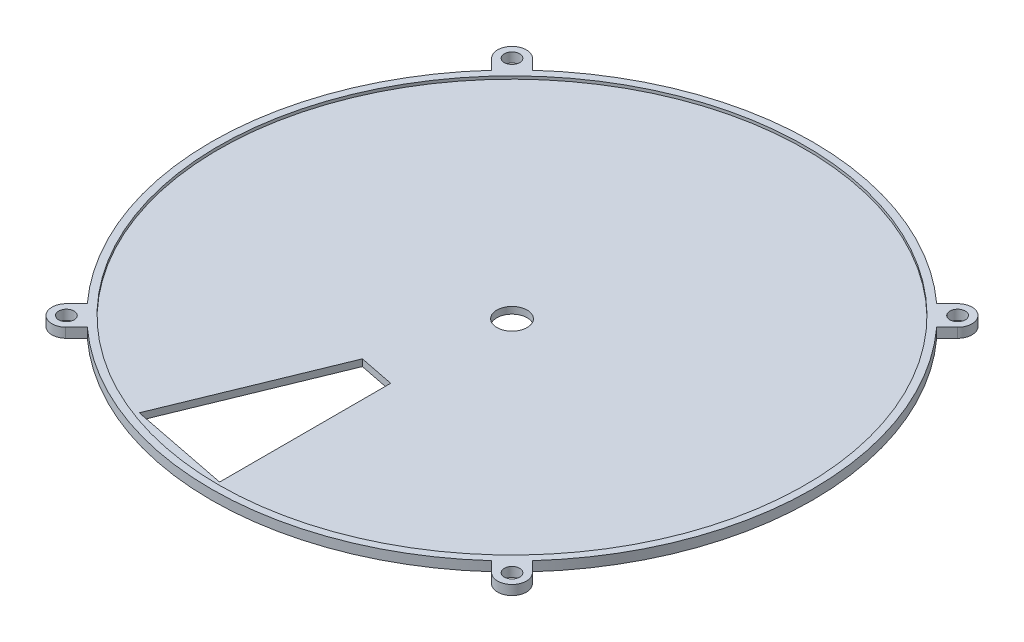
ISO-10303-21;
HEADER;
FILE_DESCRIPTION(('STEP AP214'),'2;1');
FILE_NAME('part.step','',(''),(''),'','','');
FILE_SCHEMA(('AUTOMOTIVE_DESIGN { 1 0 10303 214 1 1 1 1 }'));
ENDSEC;
DATA;
#1=APPLICATION_CONTEXT('core data for automotive mechanical design processes');
#2=APPLICATION_PROTOCOL_DEFINITION('international standard','automotive_design',2000,#1);
#3=PRODUCT_CONTEXT('',#1,'mechanical');
#4=PRODUCT('Part','Part','',(#3));
#5=PRODUCT_RELATED_PRODUCT_CATEGORY('part','',(#4));
#6=PRODUCT_DEFINITION_FORMATION('','',#4);
#7=PRODUCT_DEFINITION_CONTEXT('part definition',#1,'design');
#8=PRODUCT_DEFINITION('design','',#6,#7);
#9=PRODUCT_DEFINITION_SHAPE('','',#8);
#10=(LENGTH_UNIT() NAMED_UNIT(*) SI_UNIT(.MILLI.,.METRE.));
#11=(NAMED_UNIT(*) PLANE_ANGLE_UNIT() SI_UNIT($,.RADIAN.));
#12=(NAMED_UNIT(*) SI_UNIT($,.STERADIAN.) SOLID_ANGLE_UNIT());
#13=UNCERTAINTY_MEASURE_WITH_UNIT(LENGTH_MEASURE(1.E-05),#10,'distance_accuracy_value','');
#14=(GEOMETRIC_REPRESENTATION_CONTEXT(3) GLOBAL_UNCERTAINTY_ASSIGNED_CONTEXT((#13)) GLOBAL_UNIT_ASSIGNED_CONTEXT((#10,
#11,#12)) REPRESENTATION_CONTEXT('',''));
#15=CARTESIAN_POINT('',(0.,0.,0.));
#16=DIRECTION('',(0.,0.,1.));
#17=DIRECTION('',(1.,0.,0.));
#18=AXIS2_PLACEMENT_3D('',#15,#16,#17);
#19=CARTESIAN_POINT('',(2.11909880663364,2.,2.1190988066335));
#20=DIRECTION('',(-0.707106781186571,0.,-0.707106781186524));
#21=DIRECTION('',(-0.707106781186524,0.,0.707106781186571));
#22=AXIS2_PLACEMENT_3D('',#19,#20,#21);
#23=PLANE('',#22);
#24=DIRECTION('',(0.707106781186524,0.,-0.707106781186571));
#25=VECTOR('',#24,1.);
#26=CARTESIAN_POINT('',(2.11909880663364,0.,2.1190988066335));
#27=LINE('',#26,#25);
#28=CARTESIAN_POINT('',(-44.293453321693,0.,48.5316509349633));
#29=VERTEX_POINT('',#28);
#30=CARTESIAN_POINT('',(-42.0242406711131,0.,46.2624382843832));
#31=VERTEX_POINT('',#30);
#32=EDGE_CURVE('E270',#29,#31,#27,.T.);
#33=ORIENTED_EDGE('',*,*,#32,.T.);
#34=DIRECTION('',(0.,-1.,0.));
#35=VECTOR('',#34,1.);
#36=CARTESIAN_POINT('',(-42.0242406711131,2.,46.2624382843832));
#37=LINE('',#36,#35);
#38=CARTESIAN_POINT('',(-42.0242406711131,2.,46.2624382843832));
#39=VERTEX_POINT('',#38);
#40=EDGE_CURVE('E346',#39,#31,#37,.T.);
#41=ORIENTED_EDGE('',*,*,#40,.F.);
#42=DIRECTION('',(0.707106781186524,0.,-0.707106781186571));
#43=VECTOR('',#42,1.);
#44=CARTESIAN_POINT('',(2.11909880663364,2.,2.1190988066335));
#45=LINE('',#44,#43);
#46=CARTESIAN_POINT('',(-44.293453321693,2.,48.5316509349633));
#47=VERTEX_POINT('',#46);
#48=EDGE_CURVE('E221',#47,#39,#45,.T.);
#49=ORIENTED_EDGE('',*,*,#48,.F.);
#50=DIRECTION('',(0.,-1.,0.));
#51=VECTOR('',#50,1.);
#52=CARTESIAN_POINT('',(-44.293453321693,2.,48.5316509349633));
#53=LINE('',#52,#51);
#54=EDGE_CURVE('E258',#47,#29,#53,.T.);
#55=ORIENTED_EDGE('',*,*,#54,.T.);
#56=EDGE_LOOP('',(#33,#41,#49,#55));
#57=FACE_BOUND('',#56,.T.);
#58=ADVANCED_FACE('F35',(#57),#23,.F.);
#59=CARTESIAN_POINT('',(0.,2.,0.));
#60=DIRECTION('',(0.,-1.,0.));
#61=DIRECTION('',(0.,0.,-1.));
#62=AXIS2_PLACEMENT_3D('',#59,#60,#61);
#63=CYLINDRICAL_SURFACE('',#62,62.5);
#64=CARTESIAN_POINT('',(0.,0.,0.));
#65=DIRECTION('',(0.,1.,0.));
#66=DIRECTION('',(0.,0.,1.));
#67=AXIS2_PLACEMENT_3D('',#64,#65,#66);
#68=CIRCLE('',#67,62.5);
#69=CARTESIAN_POINT('',(42.02191243339,0.,46.2645531205102));
#70=VERTEX_POINT('',#69);
#71=EDGE_CURVE('E273',#31,#70,#68,.T.);
#72=ORIENTED_EDGE('',*,*,#71,.T.);
#73=DIRECTION('',(0.,-1.,0.));
#74=VECTOR('',#73,1.);
#75=CARTESIAN_POINT('',(42.02191243339,2.,46.2645531205102));
#76=LINE('',#75,#74);
#77=CARTESIAN_POINT('',(42.02191243339,2.,46.2645531205102));
#78=VERTEX_POINT('',#77);
#79=EDGE_CURVE('E344',#78,#70,#76,.T.);
#80=ORIENTED_EDGE('',*,*,#79,.F.);
#81=CARTESIAN_POINT('',(0.,2.,0.));
#82=DIRECTION('',(0.,1.,0.));
#83=DIRECTION('',(0.,0.,1.));
#84=AXIS2_PLACEMENT_3D('',#81,#82,#83);
#85=CIRCLE('',#84,62.5);
#86=EDGE_CURVE('E224',#39,#78,#85,.T.);
#87=ORIENTED_EDGE('',*,*,#86,.F.);
#88=ORIENTED_EDGE('',*,*,#40,.T.);
#89=EDGE_LOOP('',(#72,#80,#87,#88));
#90=FACE_BOUND('',#89,.T.);
#91=ADVANCED_FACE('F376',(#90),#63,.T.);
#92=CARTESIAN_POINT('',(-2.12132034355963,2.,2.12132034355958));
#93=DIRECTION('',(-0.707106781186555,0.,0.70710678118654));
#94=DIRECTION('',(0.70710678118654,0.,0.707106781186555));
#95=AXIS2_PLACEMENT_3D('',#92,#93,#94);
#96=PLANE('',#95);
#97=DIRECTION('',(-0.70710678118654,0.,-0.707106781186555));
#98=VECTOR('',#97,1.);
#99=CARTESIAN_POINT('',(-2.12132034355963,0.,2.12132034355958));
#100=LINE('',#99,#98);
#101=CARTESIAN_POINT('',(44.1941738241587,0.,48.4368145112789));
#102=VERTEX_POINT('',#101);
#103=EDGE_CURVE('E276',#102,#70,#100,.T.);
#104=ORIENTED_EDGE('',*,*,#103,.F.);
#105=DIRECTION('',(0.,-1.,0.));
#106=VECTOR('',#105,1.);
#107=CARTESIAN_POINT('',(44.1941738241587,2.,48.4368145112789));
#108=LINE('',#107,#106);
#109=CARTESIAN_POINT('',(44.1941738241587,2.,48.4368145112789));
#110=VERTEX_POINT('',#109);
#111=EDGE_CURVE('E342',#110,#102,#108,.T.);
#112=ORIENTED_EDGE('',*,*,#111,.F.);
#113=DIRECTION('',(-0.70710678118654,0.,-0.707106781186555));
#114=VECTOR('',#113,1.);
#115=CARTESIAN_POINT('',(-2.12132034355963,2.,2.12132034355958));
#116=LINE('',#115,#114);
#117=EDGE_CURVE('E226',#110,#78,#116,.T.);
#118=ORIENTED_EDGE('',*,*,#117,.T.);
#119=ORIENTED_EDGE('',*,*,#79,.T.);
#120=EDGE_LOOP('',(#104,#112,#118,#119));
#121=FACE_BOUND('',#120,.T.);
#122=ADVANCED_FACE('F382',(#121),#96,.T.);
#123=CARTESIAN_POINT('',(46.3154941677184,2.,46.3154941677193));
#124=DIRECTION('',(0.,-1.,0.));
#125=DIRECTION('',(0.,0.,-1.));
#126=AXIS2_PLACEMENT_3D('',#123,#124,#125);
#127=CYLINDRICAL_SURFACE('',#126,3.);
#128=CARTESIAN_POINT('',(46.3154941677184,0.,46.3154941677193));
#129=DIRECTION('',(0.,1.,0.));
#130=DIRECTION('',(0.,0.,1.));
#131=AXIS2_PLACEMENT_3D('',#128,#129,#130);
#132=CIRCLE('',#131,3.);
#133=CARTESIAN_POINT('',(48.5316509349628,0.,44.2934533216935));
#134=VERTEX_POINT('',#133);
#135=EDGE_CURVE('E279',#102,#134,#132,.T.);
#136=ORIENTED_EDGE('',*,*,#135,.T.);
#137=DIRECTION('',(0.,-1.,0.));
#138=VECTOR('',#137,1.);
#139=CARTESIAN_POINT('',(48.5316509349628,2.,44.2934533216935));
#140=LINE('',#139,#138);
#141=CARTESIAN_POINT('',(48.5316509349628,2.,44.2934533216935));
#142=VERTEX_POINT('',#141);
#143=EDGE_CURVE('E339',#142,#134,#140,.T.);
#144=ORIENTED_EDGE('',*,*,#143,.F.);
#145=CARTESIAN_POINT('',(46.3154941677184,2.,46.3154941677193));
#146=DIRECTION('',(0.,1.,0.));
#147=DIRECTION('',(0.,0.,1.));
#148=AXIS2_PLACEMENT_3D('',#145,#146,#147);
#149=CIRCLE('',#148,3.);
#150=EDGE_CURVE('E229',#110,#142,#149,.T.);
#151=ORIENTED_EDGE('',*,*,#150,.F.);
#152=ORIENTED_EDGE('',*,*,#111,.T.);
#153=EDGE_LOOP('',(#136,#144,#151,#152));
#154=FACE_BOUND('',#153,.T.);
#155=ADVANCED_FACE('F478',(#154),#127,.T.);
#156=CARTESIAN_POINT('',(2.11909880663354,2.,-2.11909880663363));
#157=DIRECTION('',(-0.707106781186531,0.,0.707106781186564));
#158=DIRECTION('',(0.707106781186564,0.,0.707106781186531));
#159=AXIS2_PLACEMENT_3D('',#156,#157,#158);
#160=PLANE('',#159);
#161=DIRECTION('',(-0.707106781186564,0.,-0.707106781186531));
#162=VECTOR('',#161,1.);
#163=CARTESIAN_POINT('',(2.11909880663354,0.,-2.11909880663363));
#164=LINE('',#163,#162);
#165=CARTESIAN_POINT('',(46.2624382843828,0.,42.0242406711136));
#166=VERTEX_POINT('',#165);
#167=EDGE_CURVE('E281',#134,#166,#164,.T.);
#168=ORIENTED_EDGE('',*,*,#167,.T.);
#169=DIRECTION('',(0.,-1.,0.));
#170=VECTOR('',#169,1.);
#171=CARTESIAN_POINT('',(46.2624382843828,2.,42.0242406711136));
#172=LINE('',#171,#170);
#173=CARTESIAN_POINT('',(46.2624382843828,2.,42.0242406711136));
#174=VERTEX_POINT('',#173);
#175=EDGE_CURVE('E336',#174,#166,#172,.T.);
#176=ORIENTED_EDGE('',*,*,#175,.F.);
#177=DIRECTION('',(-0.707106781186564,0.,-0.707106781186531));
#178=VECTOR('',#177,1.);
#179=CARTESIAN_POINT('',(2.11909880663354,2.,-2.11909880663363));
#180=LINE('',#179,#178);
#181=EDGE_CURVE('E231',#142,#174,#180,.T.);
#182=ORIENTED_EDGE('',*,*,#181,.F.);
#183=ORIENTED_EDGE('',*,*,#143,.T.);
#184=EDGE_LOOP('',(#168,#176,#182,#183));
#185=FACE_BOUND('',#184,.T.);
#186=ADVANCED_FACE('F474',(#185),#160,.F.);
#187=CARTESIAN_POINT('',(0.,2.,0.));
#188=DIRECTION('',(0.,-1.,0.));
#189=DIRECTION('',(0.,0.,-1.));
#190=AXIS2_PLACEMENT_3D('',#187,#188,#189);
#191=CYLINDRICAL_SURFACE('',#190,62.5);
#192=CARTESIAN_POINT('',(0.,0.,0.));
#193=DIRECTION('',(0.,1.,0.));
#194=DIRECTION('',(0.,0.,1.));
#195=AXIS2_PLACEMENT_3D('',#192,#193,#194);
#196=CIRCLE('',#195,62.5);
#197=CARTESIAN_POINT('',(46.26455312051,0.,-42.0219124333901));
#198=VERTEX_POINT('',#197);
#199=EDGE_CURVE('E283',#166,#198,#196,.T.);
#200=ORIENTED_EDGE('',*,*,#199,.T.);
#201=DIRECTION('',(0.,-1.,0.));
#202=VECTOR('',#201,1.);
#203=CARTESIAN_POINT('',(46.26455312051,2.,-42.0219124333901));
#204=LINE('',#203,#202);
#205=CARTESIAN_POINT('',(46.26455312051,2.,-42.0219124333901));
#206=VERTEX_POINT('',#205);
#207=EDGE_CURVE('E334',#206,#198,#204,.T.);
#208=ORIENTED_EDGE('',*,*,#207,.F.);
#209=CARTESIAN_POINT('',(0.,2.,0.));
#210=DIRECTION('',(0.,1.,0.));
#211=DIRECTION('',(0.,0.,1.));
#212=AXIS2_PLACEMENT_3D('',#209,#210,#211);
#213=CIRCLE('',#212,62.5);
#214=EDGE_CURVE('E233',#174,#206,#213,.T.);
#215=ORIENTED_EDGE('',*,*,#214,.F.);
#216=ORIENTED_EDGE('',*,*,#175,.T.);
#217=EDGE_LOOP('',(#200,#208,#215,#216));
#218=FACE_BOUND('',#217,.T.);
#219=ADVANCED_FACE('F469',(#218),#191,.T.);
#220=CARTESIAN_POINT('',(2.12132034355964,2.,2.12132034355967));
#221=DIRECTION('',(0.707106781186543,0.,0.707106781186552));
#222=DIRECTION('',(0.707106781186552,0.,-0.707106781186543));
#223=AXIS2_PLACEMENT_3D('',#220,#221,#222);
#224=PLANE('',#223);
#225=DIRECTION('',(-0.707106781186552,0.,0.707106781186543));
#226=VECTOR('',#225,1.);
#227=CARTESIAN_POINT('',(2.12132034355964,0.,2.12132034355967));
#228=LINE('',#227,#226);
#229=CARTESIAN_POINT('',(48.4368145112788,0.,-44.1941738241589));
#230=VERTEX_POINT('',#229);
#231=EDGE_CURVE('E286',#230,#198,#228,.T.);
#232=ORIENTED_EDGE('',*,*,#231,.F.);
#233=DIRECTION('',(0.,-1.,0.));
#234=VECTOR('',#233,1.);
#235=CARTESIAN_POINT('',(48.4368145112788,2.,-44.1941738241589));
#236=LINE('',#235,#234);
#237=CARTESIAN_POINT('',(48.4368145112788,2.,-44.1941738241589));
#238=VERTEX_POINT('',#237);
#239=EDGE_CURVE('E332',#238,#230,#236,.T.);
#240=ORIENTED_EDGE('',*,*,#239,.F.);
#241=DIRECTION('',(-0.707106781186552,0.,0.707106781186543));
#242=VECTOR('',#241,1.);
#243=CARTESIAN_POINT('',(2.12132034355964,2.,2.12132034355967));
#244=LINE('',#243,#242);
#245=EDGE_CURVE('E235',#238,#206,#244,.T.);
#246=ORIENTED_EDGE('',*,*,#245,.T.);
#247=ORIENTED_EDGE('',*,*,#207,.T.);
#248=EDGE_LOOP('',(#232,#240,#246,#247));
#249=FACE_BOUND('',#248,.T.);
#250=ADVANCED_FACE('F463',(#249),#224,.T.);
#251=CARTESIAN_POINT('',(46.3154941677192,2.,-46.3154941677186));
#252=DIRECTION('',(0.,-1.,0.));
#253=DIRECTION('',(0.,0.,-1.));
#254=AXIS2_PLACEMENT_3D('',#251,#252,#253);
#255=CYLINDRICAL_SURFACE('',#254,3.);
#256=CARTESIAN_POINT('',(46.3154941677192,0.,-46.3154941677186));
#257=DIRECTION('',(0.,1.,0.));
#258=DIRECTION('',(0.,0.,1.));
#259=AXIS2_PLACEMENT_3D('',#256,#257,#258);
#260=CIRCLE('',#259,3.);
#261=CARTESIAN_POINT('',(44.2934533216933,0.,-48.5316509349629));
#262=VERTEX_POINT('',#261);
#263=EDGE_CURVE('E289',#230,#262,#260,.T.);
#264=ORIENTED_EDGE('',*,*,#263,.T.);
#265=DIRECTION('',(0.,-1.,0.));
#266=VECTOR('',#265,1.);
#267=CARTESIAN_POINT('',(44.2934533216933,2.,-48.5316509349629));
#268=LINE('',#267,#266);
#269=CARTESIAN_POINT('',(44.2934533216933,2.,-48.5316509349629));
#270=VERTEX_POINT('',#269);
#271=EDGE_CURVE('E329',#270,#262,#268,.T.);
#272=ORIENTED_EDGE('',*,*,#271,.F.);
#273=CARTESIAN_POINT('',(46.3154941677192,2.,-46.3154941677186));
#274=DIRECTION('',(0.,1.,0.));
#275=DIRECTION('',(0.,0.,1.));
#276=AXIS2_PLACEMENT_3D('',#273,#274,#275);
#277=CIRCLE('',#276,3.);
#278=EDGE_CURVE('E238',#238,#270,#277,.T.);
#279=ORIENTED_EDGE('',*,*,#278,.F.);
#280=ORIENTED_EDGE('',*,*,#239,.T.);
#281=EDGE_LOOP('',(#264,#272,#279,#280));
#282=FACE_BOUND('',#281,.T.);
#283=ADVANCED_FACE('F460',(#282),#255,.T.);
#284=CARTESIAN_POINT('',(-2.11909880663366,2.,-2.11909880663355));
#285=DIRECTION('',(0.707106781186566,0.,0.707106781186529));
#286=DIRECTION('',(0.707106781186529,0.,-0.707106781186566));
#287=AXIS2_PLACEMENT_3D('',#284,#285,#286);
#288=PLANE('',#287);
#289=DIRECTION('',(-0.707106781186529,0.,0.707106781186566));
#290=VECTOR('',#289,1.);
#291=CARTESIAN_POINT('',(-2.11909880663366,0.,-2.11909880663355));
#292=LINE('',#291,#290);
#293=CARTESIAN_POINT('',(42.0242406711134,0.,-46.2624382843829));
#294=VERTEX_POINT('',#293);
#295=EDGE_CURVE('E291',#262,#294,#292,.T.);
#296=ORIENTED_EDGE('',*,*,#295,.T.);
#297=DIRECTION('',(0.,-1.,0.));
#298=VECTOR('',#297,1.);
#299=CARTESIAN_POINT('',(42.0242406711134,2.,-46.2624382843829));
#300=LINE('',#299,#298);
#301=CARTESIAN_POINT('',(42.0242406711134,2.,-46.2624382843829));
#302=VERTEX_POINT('',#301);
#303=EDGE_CURVE('E326',#302,#294,#300,.T.);
#304=ORIENTED_EDGE('',*,*,#303,.F.);
#305=DIRECTION('',(-0.707106781186529,0.,0.707106781186566));
#306=VECTOR('',#305,1.);
#307=CARTESIAN_POINT('',(-2.11909880663366,2.,-2.11909880663355));
#308=LINE('',#307,#306);
#309=EDGE_CURVE('E240',#270,#302,#308,.T.);
#310=ORIENTED_EDGE('',*,*,#309,.F.);
#311=ORIENTED_EDGE('',*,*,#271,.T.);
#312=EDGE_LOOP('',(#296,#304,#310,#311));
#313=FACE_BOUND('',#312,.T.);
#314=ADVANCED_FACE('F455',(#313),#288,.F.);
#315=CARTESIAN_POINT('',(0.,2.,0.));
#316=DIRECTION('',(0.,-1.,0.));
#317=DIRECTION('',(0.,0.,-1.));
#318=AXIS2_PLACEMENT_3D('',#315,#316,#317);
#319=CYLINDRICAL_SURFACE('',#318,62.5);
#320=CARTESIAN_POINT('',(0.,0.,0.));
#321=DIRECTION('',(0.,1.,0.));
#322=DIRECTION('',(0.,0.,1.));
#323=AXIS2_PLACEMENT_3D('',#320,#321,#322);
#324=CIRCLE('',#323,62.5);
#325=CARTESIAN_POINT('',(-42.0219124333903,0.,-46.2645531205099));
#326=VERTEX_POINT('',#325);
#327=EDGE_CURVE('E293',#294,#326,#324,.T.);
#328=ORIENTED_EDGE('',*,*,#327,.T.);
#329=DIRECTION('',(0.,-1.,0.));
#330=VECTOR('',#329,1.);
#331=CARTESIAN_POINT('',(-42.0219124333903,2.,-46.2645531205099));
#332=LINE('',#331,#330);
#333=CARTESIAN_POINT('',(-42.0219124333903,2.,-46.2645531205099));
#334=VERTEX_POINT('',#333);
#335=EDGE_CURVE('E324',#334,#326,#332,.T.);
#336=ORIENTED_EDGE('',*,*,#335,.F.);
#337=CARTESIAN_POINT('',(0.,2.,0.));
#338=DIRECTION('',(0.,1.,0.));
#339=DIRECTION('',(0.,0.,1.));
#340=AXIS2_PLACEMENT_3D('',#337,#338,#339);
#341=CIRCLE('',#340,62.5);
#342=EDGE_CURVE('E242',#302,#334,#341,.T.);
#343=ORIENTED_EDGE('',*,*,#342,.F.);
#344=ORIENTED_EDGE('',*,*,#303,.T.);
#345=EDGE_LOOP('',(#328,#336,#343,#344));
#346=FACE_BOUND('',#345,.T.);
#347=ADVANCED_FACE('F449',(#346),#319,.T.);
#348=CARTESIAN_POINT('',(2.12132034355965,2.,-2.12132034355963));
#349=DIRECTION('',(0.70710678118655,0.,-0.707106781186545));
#350=DIRECTION('',(-0.707106781186545,0.,-0.70710678118655));
#351=AXIS2_PLACEMENT_3D('',#348,#349,#350);
#352=PLANE('',#351);
#353=DIRECTION('',(0.707106781186545,0.,0.70710678118655));
#354=VECTOR('',#353,1.);
#355=CARTESIAN_POINT('',(2.12132034355965,0.,-2.12132034355963));
#356=LINE('',#355,#354);
#357=CARTESIAN_POINT('',(-44.1941738241591,0.,-48.4368145112786));
#358=VERTEX_POINT('',#357);
#359=EDGE_CURVE('E296',#358,#326,#356,.T.);
#360=ORIENTED_EDGE('',*,*,#359,.F.);
#361=DIRECTION('',(0.,-1.,0.));
#362=VECTOR('',#361,1.);
#363=CARTESIAN_POINT('',(-44.1941738241591,2.,-48.4368145112786));
#364=LINE('',#363,#362);
#365=CARTESIAN_POINT('',(-44.1941738241591,2.,-48.4368145112786));
#366=VERTEX_POINT('',#365);
#367=EDGE_CURVE('E322',#366,#358,#364,.T.);
#368=ORIENTED_EDGE('',*,*,#367,.F.);
#369=DIRECTION('',(0.707106781186545,0.,0.70710678118655));
#370=VECTOR('',#369,1.);
#371=CARTESIAN_POINT('',(2.12132034355965,2.,-2.12132034355963));
#372=LINE('',#371,#370);
#373=EDGE_CURVE('E244',#366,#334,#372,.T.);
#374=ORIENTED_EDGE('',*,*,#373,.T.);
#375=ORIENTED_EDGE('',*,*,#335,.T.);
#376=EDGE_LOOP('',(#360,#368,#374,#375));
#377=FACE_BOUND('',#376,.T.);
#378=ADVANCED_FACE('F445',(#377),#352,.T.);
#379=CARTESIAN_POINT('',(-46.3154941677187,2.,-46.315494167719));
#380=DIRECTION('',(0.,-1.,0.));
#381=DIRECTION('',(0.,0.,-1.));
#382=AXIS2_PLACEMENT_3D('',#379,#380,#381);
#383=CYLINDRICAL_SURFACE('',#382,3.);
#384=CARTESIAN_POINT('',(-46.3154941677187,0.,-46.315494167719));
#385=DIRECTION('',(0.,1.,0.));
#386=DIRECTION('',(0.,0.,1.));
#387=AXIS2_PLACEMENT_3D('',#384,#385,#386);
#388=CIRCLE('',#387,3.);
#389=CARTESIAN_POINT('',(-48.5316509349631,0.,-44.2934533216931));
#390=VERTEX_POINT('',#389);
#391=EDGE_CURVE('E299',#358,#390,#388,.T.);
#392=ORIENTED_EDGE('',*,*,#391,.T.);
#393=DIRECTION('',(0.,-1.,0.));
#394=VECTOR('',#393,1.);
#395=CARTESIAN_POINT('',(-48.5316509349631,2.,-44.2934533216931));
#396=LINE('',#395,#394);
#397=CARTESIAN_POINT('',(-48.5316509349631,2.,-44.2934533216931));
#398=VERTEX_POINT('',#397);
#399=EDGE_CURVE('E319',#398,#390,#396,.T.);
#400=ORIENTED_EDGE('',*,*,#399,.F.);
#401=CARTESIAN_POINT('',(-46.3154941677187,2.,-46.315494167719));
#402=DIRECTION('',(0.,1.,0.));
#403=DIRECTION('',(0.,0.,1.));
#404=AXIS2_PLACEMENT_3D('',#401,#402,#403);
#405=CIRCLE('',#404,3.);
#406=EDGE_CURVE('E247',#366,#398,#405,.T.);
#407=ORIENTED_EDGE('',*,*,#406,.F.);
#408=ORIENTED_EDGE('',*,*,#367,.T.);
#409=EDGE_LOOP('',(#392,#400,#407,#408));
#410=FACE_BOUND('',#409,.T.);
#411=ADVANCED_FACE('F440',(#410),#383,.T.);
#412=CARTESIAN_POINT('',(-2.1190988066335,2.,2.11909880663362));
#413=DIRECTION('',(0.707106781186526,0.,-0.707106781186569));
#414=DIRECTION('',(-0.707106781186569,0.,-0.707106781186526));
#415=AXIS2_PLACEMENT_3D('',#412,#413,#414);
#416=PLANE('',#415);
#417=DIRECTION('',(0.707106781186569,0.,0.707106781186526));
#418=VECTOR('',#417,1.);
#419=CARTESIAN_POINT('',(-2.1190988066335,0.,2.11909880663362));
#420=LINE('',#419,#418);
#421=CARTESIAN_POINT('',(-46.2624382843831,0.,-42.0242406711132));
#422=VERTEX_POINT('',#421);
#423=EDGE_CURVE('E301',#390,#422,#420,.T.);
#424=ORIENTED_EDGE('',*,*,#423,.T.);
#425=DIRECTION('',(0.,-1.,0.));
#426=VECTOR('',#425,1.);
#427=CARTESIAN_POINT('',(-46.2624382843831,2.,-42.0242406711132));
#428=LINE('',#427,#426);
#429=CARTESIAN_POINT('',(-46.2624382843831,2.,-42.0242406711132));
#430=VERTEX_POINT('',#429);
#431=EDGE_CURVE('E316',#430,#422,#428,.T.);
#432=ORIENTED_EDGE('',*,*,#431,.F.);
#433=DIRECTION('',(0.707106781186569,0.,0.707106781186526));
#434=VECTOR('',#433,1.);
#435=CARTESIAN_POINT('',(-2.1190988066335,2.,2.11909880663362));
#436=LINE('',#435,#434);
#437=EDGE_CURVE('E249',#398,#430,#436,.T.);
#438=ORIENTED_EDGE('',*,*,#437,.F.);
#439=ORIENTED_EDGE('',*,*,#399,.T.);
#440=EDGE_LOOP('',(#424,#432,#438,#439));
#441=FACE_BOUND('',#440,.T.);
#442=ADVANCED_FACE('F436',(#441),#416,.F.);
#443=CARTESIAN_POINT('',(0.,2.,0.));
#444=DIRECTION('',(0.,-1.,0.));
#445=DIRECTION('',(0.,0.,-1.));
#446=AXIS2_PLACEMENT_3D('',#443,#444,#445);
#447=CYLINDRICAL_SURFACE('',#446,62.5);
#448=CARTESIAN_POINT('',(0.,0.,0.));
#449=DIRECTION('',(0.,1.,0.));
#450=DIRECTION('',(0.,0.,1.));
#451=AXIS2_PLACEMENT_3D('',#448,#449,#450);
#452=CIRCLE('',#451,62.5);
#453=CARTESIAN_POINT('',(-46.2645531205097,0.,42.0219124333905));
#454=VERTEX_POINT('',#453);
#455=EDGE_CURVE('E303',#422,#454,#452,.T.);
#456=ORIENTED_EDGE('',*,*,#455,.T.);
#457=DIRECTION('',(0.,-1.,0.));
#458=VECTOR('',#457,1.);
#459=CARTESIAN_POINT('',(-46.2645531205097,2.,42.0219124333905));
#460=LINE('',#459,#458);
#461=CARTESIAN_POINT('',(-46.2645531205097,2.,42.0219124333905));
#462=VERTEX_POINT('',#461);
#463=EDGE_CURVE('E314',#462,#454,#460,.T.);
#464=ORIENTED_EDGE('',*,*,#463,.F.);
#465=CARTESIAN_POINT('',(0.,2.,0.));
#466=DIRECTION('',(0.,1.,0.));
#467=DIRECTION('',(0.,0.,1.));
#468=AXIS2_PLACEMENT_3D('',#465,#466,#467);
#469=CIRCLE('',#468,62.5);
#470=EDGE_CURVE('E251',#430,#462,#469,.T.);
#471=ORIENTED_EDGE('',*,*,#470,.F.);
#472=ORIENTED_EDGE('',*,*,#431,.T.);
#473=EDGE_LOOP('',(#456,#464,#471,#472));
#474=FACE_BOUND('',#473,.T.);
#475=ADVANCED_FACE('F431',(#474),#447,.T.);
#476=CARTESIAN_POINT('',(-2.12132034355963,2.,-2.12132034355963));
#477=DIRECTION('',(-0.707106781186547,0.,-0.707106781186547));
#478=DIRECTION('',(-0.707106781186548,0.,0.707106781186548));
#479=AXIS2_PLACEMENT_3D('',#476,#477,#478);
#480=PLANE('',#479);
#481=DIRECTION('',(0.707106781186548,0.,-0.707106781186548));
#482=VECTOR('',#481,1.);
#483=CARTESIAN_POINT('',(-2.12132034355963,0.,-2.12132034355963));
#484=LINE('',#483,#482);
#485=CARTESIAN_POINT('',(-48.4368145112785,0.,44.1941738241592));
#486=VERTEX_POINT('',#485);
#487=EDGE_CURVE('E306',#486,#454,#484,.T.);
#488=ORIENTED_EDGE('',*,*,#487,.F.);
#489=DIRECTION('',(0.,-1.,0.));
#490=VECTOR('',#489,1.);
#491=CARTESIAN_POINT('',(-48.4368145112785,2.,44.1941738241592));
#492=LINE('',#491,#490);
#493=CARTESIAN_POINT('',(-48.4368145112785,2.,44.1941738241592));
#494=VERTEX_POINT('',#493);
#495=EDGE_CURVE('E312',#494,#486,#492,.T.);
#496=ORIENTED_EDGE('',*,*,#495,.F.);
#497=DIRECTION('',(0.707106781186548,0.,-0.707106781186548));
#498=VECTOR('',#497,1.);
#499=CARTESIAN_POINT('',(-2.12132034355963,2.,-2.12132034355963));
#500=LINE('',#499,#498);
#501=EDGE_CURVE('E253',#494,#462,#500,.T.);
#502=ORIENTED_EDGE('',*,*,#501,.T.);
#503=ORIENTED_EDGE('',*,*,#463,.T.);
#504=EDGE_LOOP('',(#488,#496,#502,#503));
#505=FACE_BOUND('',#504,.T.);
#506=ADVANCED_FACE('F391',(#505),#480,.T.);
#507=CARTESIAN_POINT('',(46.3154941677184,2.,46.3154941677193));
#508=DIRECTION('',(0.,-1.,0.));
#509=DIRECTION('',(0.,0.,-1.));
#510=AXIS2_PLACEMENT_3D('',#507,#508,#509);
#511=CYLINDRICAL_SURFACE('',#510,1.6);
#512=CARTESIAN_POINT('',(46.3154941677184,2.,46.3154941677193));
#513=DIRECTION('',(0.,1.,0.));
#514=DIRECTION('',(0.,0.,1.));
#515=AXIS2_PLACEMENT_3D('',#512,#513,#514);
#516=CIRCLE('',#515,1.6);
#517=CARTESIAN_POINT('',(46.3154941677184,2.,47.9154941677193));
#518=VERTEX_POINT('',#517);
#519=EDGE_CURVE('E218',#518,#518,#516,.T.);
#520=ORIENTED_EDGE('',*,*,#519,.T.);
#521=EDGE_LOOP('',(#520));
#522=FACE_BOUND('',#521,.T.);
#523=CARTESIAN_POINT('',(46.3154941677184,0.,46.3154941677193));
#524=DIRECTION('',(0.,1.,0.));
#525=DIRECTION('',(0.,0.,1.));
#526=AXIS2_PLACEMENT_3D('',#523,#524,#525);
#527=CIRCLE('',#526,1.6);
#528=CARTESIAN_POINT('',(46.3154941677184,0.,47.9154941677193));
#529=VERTEX_POINT('',#528);
#530=EDGE_CURVE('E267',#529,#529,#527,.T.);
#531=ORIENTED_EDGE('',*,*,#530,.F.);
#532=EDGE_LOOP('',(#531));
#533=FACE_BOUND('',#532,.T.);
#534=ADVANCED_FACE('F387',(#522,#533),#511,.F.);
#535=CARTESIAN_POINT('',(46.3154941677192,2.,-46.3154941677186));
#536=DIRECTION('',(0.,-1.,0.));
#537=DIRECTION('',(0.,0.,-1.));
#538=AXIS2_PLACEMENT_3D('',#535,#536,#537);
#539=CYLINDRICAL_SURFACE('',#538,1.6);
#540=CARTESIAN_POINT('',(46.3154941677192,2.,-46.3154941677186));
#541=DIRECTION('',(0.,1.,0.));
#542=DIRECTION('',(0.,0.,1.));
#543=AXIS2_PLACEMENT_3D('',#540,#541,#542);
#544=CIRCLE('',#543,1.6);
#545=CARTESIAN_POINT('',(46.3154941677192,2.,-44.7154941677185));
#546=VERTEX_POINT('',#545);
#547=EDGE_CURVE('E215',#546,#546,#544,.T.);
#548=ORIENTED_EDGE('',*,*,#547,.T.);
#549=EDGE_LOOP('',(#548));
#550=FACE_BOUND('',#549,.T.);
#551=CARTESIAN_POINT('',(46.3154941677192,0.,-46.3154941677186));
#552=DIRECTION('',(0.,1.,0.));
#553=DIRECTION('',(0.,0.,1.));
#554=AXIS2_PLACEMENT_3D('',#551,#552,#553);
#555=CIRCLE('',#554,1.6);
#556=CARTESIAN_POINT('',(46.3154941677192,0.,-44.7154941677185));
#557=VERTEX_POINT('',#556);
#558=EDGE_CURVE('E264',#557,#557,#555,.T.);
#559=ORIENTED_EDGE('',*,*,#558,.F.);
#560=EDGE_LOOP('',(#559));
#561=FACE_BOUND('',#560,.T.);
#562=ADVANCED_FACE('F390',(#550,#561),#539,.F.);
#563=CARTESIAN_POINT('',(-46.3154941677187,2.,-46.315494167719));
#564=DIRECTION('',(0.,-1.,0.));
#565=DIRECTION('',(0.,0.,-1.));
#566=AXIS2_PLACEMENT_3D('',#563,#564,#565);
#567=CYLINDRICAL_SURFACE('',#566,1.6);
#568=CARTESIAN_POINT('',(-46.3154941677187,2.,-46.315494167719));
#569=DIRECTION('',(0.,1.,0.));
#570=DIRECTION('',(0.,0.,1.));
#571=AXIS2_PLACEMENT_3D('',#568,#569,#570);
#572=CIRCLE('',#571,1.6);
#573=CARTESIAN_POINT('',(-46.3154941677187,2.,-44.715494167719));
#574=VERTEX_POINT('',#573);
#575=EDGE_CURVE('E211',#574,#574,#572,.T.);
#576=ORIENTED_EDGE('',*,*,#575,.T.);
#577=EDGE_LOOP('',(#576));
#578=FACE_BOUND('',#577,.T.);
#579=CARTESIAN_POINT('',(-46.3154941677187,0.,-46.315494167719));
#580=DIRECTION('',(0.,1.,0.));
#581=DIRECTION('',(0.,0.,1.));
#582=AXIS2_PLACEMENT_3D('',#579,#580,#581);
#583=CIRCLE('',#582,1.6);
#584=CARTESIAN_POINT('',(-46.3154941677187,0.,-44.715494167719));
#585=VERTEX_POINT('',#584);
#586=EDGE_CURVE('E261',#585,#585,#583,.T.);
#587=ORIENTED_EDGE('',*,*,#586,.F.);
#588=EDGE_LOOP('',(#587));
#589=FACE_BOUND('',#588,.T.);
#590=ADVANCED_FACE('F394',(#578,#589),#567,.F.);
#591=CARTESIAN_POINT('',(-46.3154941677189,2.,46.3154941677189));
#592=DIRECTION('',(0.,-1.,0.));
#593=DIRECTION('',(0.,0.,-1.));
#594=AXIS2_PLACEMENT_3D('',#591,#592,#593);
#595=CYLINDRICAL_SURFACE('',#594,1.6);
#596=CARTESIAN_POINT('',(-46.3154941677189,2.,46.3154941677189));
#597=DIRECTION('',(0.,1.,0.));
#598=DIRECTION('',(0.,0.,1.));
#599=AXIS2_PLACEMENT_3D('',#596,#597,#598);
#600=CIRCLE('',#599,1.6);
#601=CARTESIAN_POINT('',(-46.3154941677189,2.,47.9154941677189));
#602=VERTEX_POINT('',#601);
#603=EDGE_CURVE('E208',#602,#602,#600,.T.);
#604=ORIENTED_EDGE('',*,*,#603,.T.);
#605=EDGE_LOOP('',(#604));
#606=FACE_BOUND('',#605,.T.);
#607=CARTESIAN_POINT('',(-46.3154941677189,0.,46.3154941677189));
#608=DIRECTION('',(0.,1.,0.));
#609=DIRECTION('',(0.,0.,1.));
#610=AXIS2_PLACEMENT_3D('',#607,#608,#609);
#611=CIRCLE('',#610,1.6);
#612=CARTESIAN_POINT('',(-46.3154941677189,0.,47.9154941677189));
#613=VERTEX_POINT('',#612);
#614=EDGE_CURVE('E205',#613,#613,#611,.T.);
#615=ORIENTED_EDGE('',*,*,#614,.F.);
#616=EDGE_LOOP('',(#615));
#617=FACE_BOUND('',#616,.T.);
#618=ADVANCED_FACE('F37',(#606,#617),#595,.F.);
#619=CARTESIAN_POINT('',(-46.3154941677189,2.,46.3154941677189));
#620=DIRECTION('',(0.,-1.,0.));
#621=DIRECTION('',(0.,0.,-1.));
#622=AXIS2_PLACEMENT_3D('',#619,#620,#621);
#623=CYLINDRICAL_SURFACE('',#622,3.);
#624=CARTESIAN_POINT('',(-46.3154941677189,0.,46.3154941677189));
#625=DIRECTION('',(0.,1.,0.));
#626=DIRECTION('',(0.,0.,1.));
#627=AXIS2_PLACEMENT_3D('',#624,#625,#626);
#628=CIRCLE('',#627,3.);
#629=EDGE_CURVE('E212',#486,#29,#628,.T.);
#630=ORIENTED_EDGE('',*,*,#629,.T.);
#631=ORIENTED_EDGE('',*,*,#54,.F.);
#632=CARTESIAN_POINT('',(-46.3154941677189,2.,46.3154941677189));
#633=DIRECTION('',(0.,1.,0.));
#634=DIRECTION('',(0.,0.,1.));
#635=AXIS2_PLACEMENT_3D('',#632,#633,#634);
#636=CIRCLE('',#635,3.);
#637=EDGE_CURVE('E256',#494,#47,#636,.T.);
#638=ORIENTED_EDGE('',*,*,#637,.F.);
#639=ORIENTED_EDGE('',*,*,#495,.T.);
#640=EDGE_LOOP('',(#630,#631,#638,#639));
#641=FACE_BOUND('',#640,.T.);
#642=ADVANCED_FACE('F401',(#641),#623,.T.);
#643=CARTESIAN_POINT('',(0.,2.,0.));
#644=DIRECTION('',(0.,1.,0.));
#645=DIRECTION('',(0.,0.,1.));
#646=AXIS2_PLACEMENT_3D('',#643,#644,#645);
#647=PLANE('',#646);
#648=CARTESIAN_POINT('',(0.,2.,0.));
#649=DIRECTION('',(0.,1.,0.));
#650=DIRECTION('',(0.,0.,1.));
#651=AXIS2_PLACEMENT_3D('',#648,#649,#650);
#652=CIRCLE('',#651,61.);
#653=CARTESIAN_POINT('',(0.,2.,61.));
#654=VERTEX_POINT('',#653);
#655=EDGE_CURVE('E201',#654,#654,#652,.T.);
#656=ORIENTED_EDGE('',*,*,#655,.F.);
#657=EDGE_LOOP('',(#656));
#658=FACE_BOUND('',#657,.T.);
#659=ORIENTED_EDGE('',*,*,#603,.F.);
#660=EDGE_LOOP('',(#659));
#661=FACE_BOUND('',#660,.T.);
#662=ORIENTED_EDGE('',*,*,#575,.F.);
#663=EDGE_LOOP('',(#662));
#664=FACE_BOUND('',#663,.T.);
#665=ORIENTED_EDGE('',*,*,#547,.F.);
#666=EDGE_LOOP('',(#665));
#667=FACE_BOUND('',#666,.T.);
#668=ORIENTED_EDGE('',*,*,#519,.F.);
#669=EDGE_LOOP('',(#668));
#670=FACE_BOUND('',#669,.T.);
#671=ORIENTED_EDGE('',*,*,#48,.T.);
#672=ORIENTED_EDGE('',*,*,#86,.T.);
#673=ORIENTED_EDGE('',*,*,#117,.F.);
#674=ORIENTED_EDGE('',*,*,#150,.T.);
#675=ORIENTED_EDGE('',*,*,#181,.T.);
#676=ORIENTED_EDGE('',*,*,#214,.T.);
#677=ORIENTED_EDGE('',*,*,#245,.F.);
#678=ORIENTED_EDGE('',*,*,#278,.T.);
#679=ORIENTED_EDGE('',*,*,#309,.T.);
#680=ORIENTED_EDGE('',*,*,#342,.T.);
#681=ORIENTED_EDGE('',*,*,#373,.F.);
#682=ORIENTED_EDGE('',*,*,#406,.T.);
#683=ORIENTED_EDGE('',*,*,#437,.T.);
#684=ORIENTED_EDGE('',*,*,#470,.T.);
#685=ORIENTED_EDGE('',*,*,#501,.F.);
#686=ORIENTED_EDGE('',*,*,#637,.T.);
#687=EDGE_LOOP('',(#671,#672,#673,#674,#675,#676,#677,#678,#679,#680,#681,#682,#683,#684,#685,#686));
#688=FACE_BOUND('',#687,.T.);
#689=ADVANCED_FACE('F410',(#658,#661,#664,#667,#670,#688),#647,.T.);
#690=CARTESIAN_POINT('',(0.,0.,0.));
#691=DIRECTION('',(0.,1.,0.));
#692=DIRECTION('',(0.,0.,1.));
#693=AXIS2_PLACEMENT_3D('',#690,#691,#692);
#694=PLANE('',#693);
#695=DIRECTION('',(-0.980785280403231,0.,-0.195090322016128));
#696=VECTOR('',#695,1.);
#697=CARTESIAN_POINT('',(-4.67248648068766,0.,23.4901758107853));
#698=LINE('',#697,#696);
#699=CARTESIAN_POINT('',(-1.,0.,24.2206787908287));
#700=VERTEX_POINT('',#699);
#701=CARTESIAN_POINT('',(-8.34167509292234,0.,22.7603288175632));
#702=VERTEX_POINT('',#701);
#703=EDGE_CURVE('E168',#700,#702,#698,.T.);
#704=ORIENTED_EDGE('',*,*,#703,.T.);
#705=DIRECTION('',(-0.378973902423538,0.,0.925407359643241));
#706=VECTOR('',#705,1.);
#707=CARTESIAN_POINT('',(0.838532994451592,0.,0.343397010956044));
#708=LINE('',#707,#706);
#709=CARTESIAN_POINT('',(-21.8183111293748,0.,55.6686058561983));
#710=VERTEX_POINT('',#709);
#711=EDGE_CURVE('E190',#702,#710,#708,.T.);
#712=ORIENTED_EDGE('',*,*,#711,.T.);
#713=DIRECTION('',(-0.981024404411302,0.,-0.193884290104822));
#714=VECTOR('',#713,1.);
#715=CARTESIAN_POINT('',(-11.4086341436075,0.,57.7259174006722));
#716=LINE('',#715,#714);
#717=CARTESIAN_POINT('',(-1.,0.,59.7830228435334));
#718=VERTEX_POINT('',#717);
#719=EDGE_CURVE('E188',#718,#710,#716,.T.);
#720=ORIENTED_EDGE('',*,*,#719,.F.);
#721=DIRECTION('',(0.,0.,-1.));
#722=VECTOR('',#721,1.);
#723=CARTESIAN_POINT('',(-0.999999999999999,0.,0.));
#724=LINE('',#723,#722);
#725=EDGE_CURVE('E173',#718,#700,#724,.T.);
#726=ORIENTED_EDGE('',*,*,#725,.T.);
#727=EDGE_LOOP('',(#704,#712,#720,#726));
#728=FACE_BOUND('',#727,.T.);
#729=CARTESIAN_POINT('',(0.,0.,0.));
#730=DIRECTION('',(0.,1.,0.));
#731=DIRECTION('',(0.,0.,1.));
#732=AXIS2_PLACEMENT_3D('',#729,#730,#731);
#733=CIRCLE('',#732,3.15);
#734=CARTESIAN_POINT('',(0.,0.,3.15));
#735=VERTEX_POINT('',#734);
#736=EDGE_CURVE('E198',#735,#735,#733,.T.);
#737=ORIENTED_EDGE('',*,*,#736,.T.);
#738=EDGE_LOOP('',(#737));
#739=FACE_BOUND('',#738,.T.);
#740=ORIENTED_EDGE('',*,*,#614,.T.);
#741=EDGE_LOOP('',(#740));
#742=FACE_BOUND('',#741,.T.);
#743=ORIENTED_EDGE('',*,*,#586,.T.);
#744=EDGE_LOOP('',(#743));
#745=FACE_BOUND('',#744,.T.);
#746=ORIENTED_EDGE('',*,*,#558,.T.);
#747=EDGE_LOOP('',(#746));
#748=FACE_BOUND('',#747,.T.);
#749=ORIENTED_EDGE('',*,*,#530,.T.);
#750=EDGE_LOOP('',(#749));
#751=FACE_BOUND('',#750,.T.);
#752=ORIENTED_EDGE('',*,*,#32,.F.);
#753=ORIENTED_EDGE('',*,*,#629,.F.);
#754=ORIENTED_EDGE('',*,*,#487,.T.);
#755=ORIENTED_EDGE('',*,*,#455,.F.);
#756=ORIENTED_EDGE('',*,*,#423,.F.);
#757=ORIENTED_EDGE('',*,*,#391,.F.);
#758=ORIENTED_EDGE('',*,*,#359,.T.);
#759=ORIENTED_EDGE('',*,*,#327,.F.);
#760=ORIENTED_EDGE('',*,*,#295,.F.);
#761=ORIENTED_EDGE('',*,*,#263,.F.);
#762=ORIENTED_EDGE('',*,*,#231,.T.);
#763=ORIENTED_EDGE('',*,*,#199,.F.);
#764=ORIENTED_EDGE('',*,*,#167,.F.);
#765=ORIENTED_EDGE('',*,*,#135,.F.);
#766=ORIENTED_EDGE('',*,*,#103,.T.);
#767=ORIENTED_EDGE('',*,*,#71,.F.);
#768=EDGE_LOOP('',(#752,#753,#754,#755,#756,#757,#758,#759,#760,#761,#762,#763,#764,#765,#766,#767));
#769=FACE_BOUND('',#768,.T.);
#770=ADVANCED_FACE('F186',(#728,#739,#742,#745,#748,#751,#769),#694,.F.);
#771=CARTESIAN_POINT('',(0.,1.4,0.));
#772=DIRECTION('',(0.,1.,0.));
#773=DIRECTION('',(0.,0.,1.));
#774=AXIS2_PLACEMENT_3D('',#771,#772,#773);
#775=CYLINDRICAL_SURFACE('',#774,61.);
#776=CARTESIAN_POINT('',(0.,1.4,0.));
#777=DIRECTION('',(0.,1.,0.));
#778=DIRECTION('',(0.,0.,1.));
#779=AXIS2_PLACEMENT_3D('',#776,#777,#778);
#780=CIRCLE('',#779,61.);
#781=CARTESIAN_POINT('',(0.,1.4,61.));
#782=VERTEX_POINT('',#781);
#783=EDGE_CURVE('E202',#782,#782,#780,.T.);
#784=ORIENTED_EDGE('',*,*,#783,.F.);
#785=EDGE_LOOP('',(#784));
#786=FACE_BOUND('',#785,.T.);
#787=ORIENTED_EDGE('',*,*,#655,.T.);
#788=EDGE_LOOP('',(#787));
#789=FACE_BOUND('',#788,.T.);
#790=ADVANCED_FACE('F409',(#786,#789),#775,.F.);
#791=CARTESIAN_POINT('',(0.,1.4,0.));
#792=DIRECTION('',(0.,1.,0.));
#793=DIRECTION('',(0.,0.,1.));
#794=AXIS2_PLACEMENT_3D('',#791,#792,#793);
#795=PLANE('',#794);
#796=DIRECTION('',(-0.378973902423538,0.,0.925407359643241));
#797=VECTOR('',#796,1.);
#798=CARTESIAN_POINT('',(0.838532994451592,1.4,0.343397010956044));
#799=LINE('',#798,#797);
#800=CARTESIAN_POINT('',(-8.34167509292234,1.40000000000001,22.7603288175632));
#801=VERTEX_POINT('',#800);
#802=CARTESIAN_POINT('',(-21.8183111293748,1.40000000000001,55.6686058561983));
#803=VERTEX_POINT('',#802);
#804=EDGE_CURVE('E11',#801,#803,#799,.T.);
#805=ORIENTED_EDGE('',*,*,#804,.F.);
#806=DIRECTION('',(-0.980785280403231,0.,-0.195090322016128));
#807=VECTOR('',#806,1.);
#808=CARTESIAN_POINT('',(-4.67248648068766,1.4,23.4901758107853));
#809=LINE('',#808,#807);
#810=CARTESIAN_POINT('',(-1.,1.4,24.2206787908287));
#811=VERTEX_POINT('',#810);
#812=EDGE_CURVE('E349',#811,#801,#809,.T.);
#813=ORIENTED_EDGE('',*,*,#812,.F.);
#814=DIRECTION('',(0.,0.,-1.));
#815=VECTOR('',#814,1.);
#816=CARTESIAN_POINT('',(-0.999999999999999,1.4,0.));
#817=LINE('',#816,#815);
#818=CARTESIAN_POINT('',(-1.,1.40000000000001,59.7830228435334));
#819=VERTEX_POINT('',#818);
#820=EDGE_CURVE('E181',#819,#811,#817,.T.);
#821=ORIENTED_EDGE('',*,*,#820,.F.);
#822=DIRECTION('',(-0.981024404411302,0.,-0.193884290104822));
#823=VECTOR('',#822,1.);
#824=CARTESIAN_POINT('',(-11.4086341436075,1.4,57.7259174006722));
#825=LINE('',#824,#823);
#826=EDGE_CURVE('E43',#819,#803,#825,.T.);
#827=ORIENTED_EDGE('',*,*,#826,.T.);
#828=EDGE_LOOP('',(#805,#813,#821,#827));
#829=FACE_BOUND('',#828,.T.);
#830=CARTESIAN_POINT('',(0.,1.4,0.));
#831=DIRECTION('',(0.,1.,0.));
#832=DIRECTION('',(0.,0.,1.));
#833=AXIS2_PLACEMENT_3D('',#830,#831,#832);
#834=CIRCLE('',#833,3.15);
#835=CARTESIAN_POINT('',(0.,1.4,3.15));
#836=VERTEX_POINT('',#835);
#837=EDGE_CURVE('E195',#836,#836,#834,.T.);
#838=ORIENTED_EDGE('',*,*,#837,.F.);
#839=EDGE_LOOP('',(#838));
#840=FACE_BOUND('',#839,.T.);
#841=ORIENTED_EDGE('',*,*,#783,.T.);
#842=EDGE_LOOP('',(#841));
#843=FACE_BOUND('',#842,.T.);
#844=ADVANCED_FACE('F354',(#829,#840,#843),#795,.T.);
#845=CARTESIAN_POINT('',(0.,-0.6,0.));
#846=DIRECTION('',(0.,1.,0.));
#847=DIRECTION('',(0.,0.,1.));
#848=AXIS2_PLACEMENT_3D('',#845,#846,#847);
#849=CYLINDRICAL_SURFACE('',#848,3.15);
#850=ORIENTED_EDGE('',*,*,#837,.T.);
#851=EDGE_LOOP('',(#850));
#852=FACE_BOUND('',#851,.T.);
#853=ORIENTED_EDGE('',*,*,#736,.F.);
#854=EDGE_LOOP('',(#853));
#855=FACE_BOUND('',#854,.T.);
#856=ADVANCED_FACE('F365',(#852,#855),#849,.F.);
#857=CARTESIAN_POINT('',(-21.8183111293748,56.,55.6686058561983));
#858=DIRECTION('',(-0.925407359643241,0.,-0.378973902423537));
#859=DIRECTION('',(-0.378973902423538,0.,0.925407359643241));
#860=AXIS2_PLACEMENT_3D('',#857,#858,#859);
#861=PLANE('',#860);
#862=DIRECTION('',(0.,-1.,0.));
#863=VECTOR('',#862,1.);
#864=CARTESIAN_POINT('',(-8.34167509292234,56.,22.7603288175632));
#865=LINE('',#864,#863);
#866=EDGE_CURVE('E50',#801,#702,#865,.T.);
#867=ORIENTED_EDGE('',*,*,#866,.F.);
#868=ORIENTED_EDGE('',*,*,#804,.T.);
#869=DIRECTION('',(0.,-1.,0.));
#870=VECTOR('',#869,1.);
#871=CARTESIAN_POINT('',(-21.8183111293748,56.,55.6686058561983));
#872=LINE('',#871,#870);
#873=EDGE_CURVE('E174',#803,#710,#872,.T.);
#874=ORIENTED_EDGE('',*,*,#873,.T.);
#875=ORIENTED_EDGE('',*,*,#711,.F.);
#876=EDGE_LOOP('',(#867,#868,#874,#875));
#877=FACE_BOUND('',#876,.T.);
#878=ADVANCED_FACE('F363',(#877),#861,.F.);
#879=CARTESIAN_POINT('',(-21.8183111293748,56.,55.6686058561983));
#880=DIRECTION('',(0.193884290104822,0.,-0.981024404411302));
#881=DIRECTION('',(-0.981024404411302,0.,-0.193884290104822));
#882=AXIS2_PLACEMENT_3D('',#879,#880,#881);
#883=PLANE('',#882);
#884=ORIENTED_EDGE('',*,*,#719,.T.);
#885=ORIENTED_EDGE('',*,*,#873,.F.);
#886=ORIENTED_EDGE('',*,*,#826,.F.);
#887=DIRECTION('',(0.,-1.,0.));
#888=VECTOR('',#887,1.);
#889=CARTESIAN_POINT('',(-1.,56.,59.7830228435334));
#890=LINE('',#889,#888);
#891=EDGE_CURVE('E183',#819,#718,#890,.T.);
#892=ORIENTED_EDGE('',*,*,#891,.T.);
#893=EDGE_LOOP('',(#884,#885,#886,#892));
#894=FACE_BOUND('',#893,.T.);
#895=ADVANCED_FACE('F358',(#894),#883,.T.);
#896=CARTESIAN_POINT('',(-1.,56.,24.2206787908287));
#897=DIRECTION('',(1.,0.,0.));
#898=DIRECTION('',(0.,0.,-1.));
#899=AXIS2_PLACEMENT_3D('',#896,#897,#898);
#900=PLANE('',#899);
#901=ORIENTED_EDGE('',*,*,#891,.F.);
#902=ORIENTED_EDGE('',*,*,#820,.T.);
#903=DIRECTION('',(0.,-1.,0.));
#904=VECTOR('',#903,1.);
#905=CARTESIAN_POINT('',(-1.,56.,24.2206787908287));
#906=LINE('',#905,#904);
#907=EDGE_CURVE('E55',#811,#700,#906,.T.);
#908=ORIENTED_EDGE('',*,*,#907,.T.);
#909=ORIENTED_EDGE('',*,*,#725,.F.);
#910=EDGE_LOOP('',(#901,#902,#908,#909));
#911=FACE_BOUND('',#910,.T.);
#912=ADVANCED_FACE('F178',(#911),#900,.F.);
#913=CARTESIAN_POINT('',(-8.34167509292234,56.,22.7603288175632));
#914=DIRECTION('',(0.195090322016128,0.,-0.98078528040323));
#915=DIRECTION('',(-0.980785280403231,0.,-0.195090322016128));
#916=AXIS2_PLACEMENT_3D('',#913,#914,#915);
#917=PLANE('',#916);
#918=ORIENTED_EDGE('',*,*,#907,.F.);
#919=ORIENTED_EDGE('',*,*,#812,.T.);
#920=ORIENTED_EDGE('',*,*,#866,.T.);
#921=ORIENTED_EDGE('',*,*,#703,.F.);
#922=EDGE_LOOP('',(#918,#919,#920,#921));
#923=FACE_BOUND('',#922,.T.);
#924=ADVANCED_FACE('F169',(#923),#917,.F.);
#925=CLOSED_SHELL('',(#58,#91,#122,#155,#186,#219,#250,#283,#314,#347,#378,#411,#442,#475,#506,
#534,#562,#590,#618,#642,#689,#770,#790,#844,#856,#878,#895,#912,#924));
#926=MANIFOLD_SOLID_BREP('B2',#925);
#927=ADVANCED_BREP_SHAPE_REPRESENTATION('',(#18,#926),#14);
#928=SHAPE_DEFINITION_REPRESENTATION(#9,#927);
ENDSEC;
END-ISO-10303-21;
